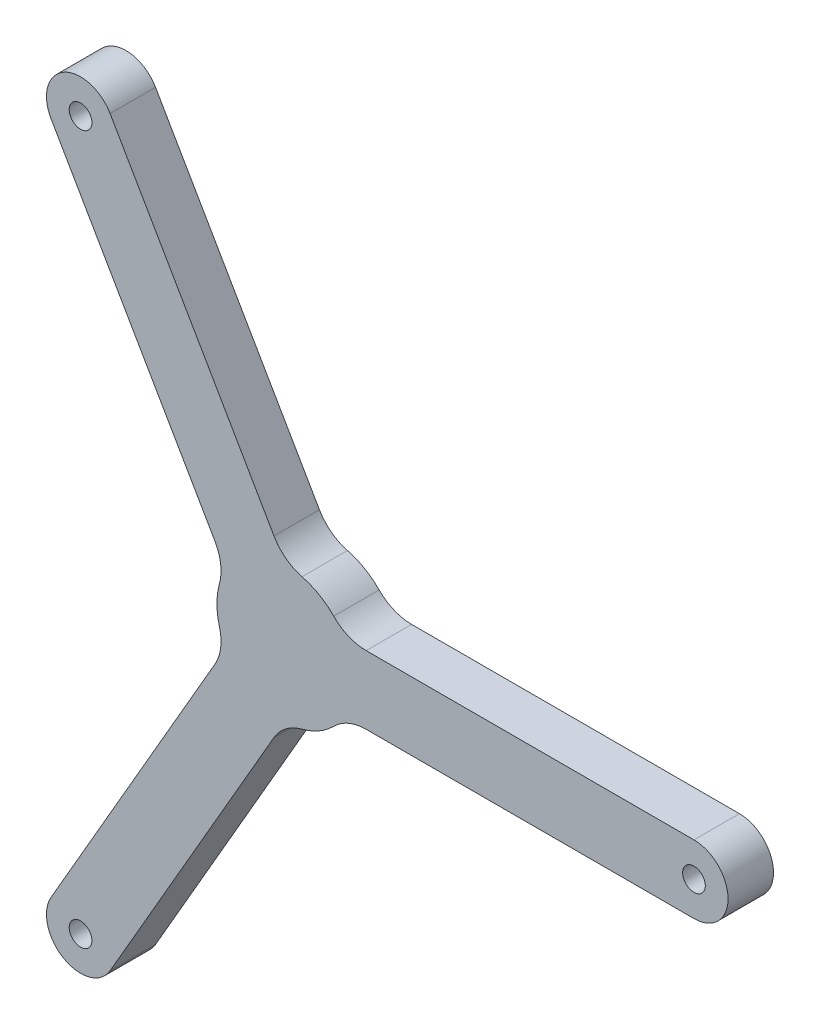
ISO-10303-21;
HEADER;
FILE_DESCRIPTION(('STEP AP214'),'2;1');
FILE_NAME('part.step','',(''),(''),'','','');
FILE_SCHEMA(('AUTOMOTIVE_DESIGN { 1 0 10303 214 1 1 1 1 }'));
ENDSEC;
DATA;
#1=APPLICATION_CONTEXT('core data for automotive mechanical design processes');
#2=APPLICATION_PROTOCOL_DEFINITION('international standard','automotive_design',2000,#1);
#3=PRODUCT_CONTEXT('',#1,'mechanical');
#4=PRODUCT('Part','Part','',(#3));
#5=PRODUCT_RELATED_PRODUCT_CATEGORY('part','',(#4));
#6=PRODUCT_DEFINITION_FORMATION('','',#4);
#7=PRODUCT_DEFINITION_CONTEXT('part definition',#1,'design');
#8=PRODUCT_DEFINITION('design','',#6,#7);
#9=PRODUCT_DEFINITION_SHAPE('','',#8);
#10=(LENGTH_UNIT() NAMED_UNIT(*) SI_UNIT(.MILLI.,.METRE.));
#11=(NAMED_UNIT(*) PLANE_ANGLE_UNIT() SI_UNIT($,.RADIAN.));
#12=(NAMED_UNIT(*) SI_UNIT($,.STERADIAN.) SOLID_ANGLE_UNIT());
#13=UNCERTAINTY_MEASURE_WITH_UNIT(LENGTH_MEASURE(1.E-05),#10,'distance_accuracy_value','');
#14=(GEOMETRIC_REPRESENTATION_CONTEXT(3) GLOBAL_UNCERTAINTY_ASSIGNED_CONTEXT((#13)) GLOBAL_UNIT_ASSIGNED_CONTEXT((#10,
#11,#12)) REPRESENTATION_CONTEXT('',''));
#15=CARTESIAN_POINT('',(0.,0.,0.));
#16=DIRECTION('',(0.,0.,1.));
#17=DIRECTION('',(1.,0.,0.));
#18=AXIS2_PLACEMENT_3D('',#15,#16,#17);
#19=CARTESIAN_POINT('',(0.,0.,10.));
#20=DIRECTION('',(0.,0.,-1.));
#21=DIRECTION('',(-1.,0.,0.));
#22=AXIS2_PLACEMENT_3D('',#19,#20,#21);
#23=CYLINDRICAL_SURFACE('',#22,15.);
#24=DIRECTION('',(0.,0.,-1.));
#25=VECTOR('',#24,1.);
#26=CARTESIAN_POINT('',(-14.4493380611438,-4.02698765763967,10.));
#27=LINE('',#26,#25);
#28=CARTESIAN_POINT('',(-14.4493380611438,-4.02698765763967,0.));
#29=VERTEX_POINT('',#28);
#30=CARTESIAN_POINT('',(-14.4493380611438,-4.02698765763967,10.));
#31=VERTEX_POINT('',#30);
#32=EDGE_CURVE('E60',#29,#31,#27,.F.);
#33=ORIENTED_EDGE('',*,*,#32,.T.);
#34=CARTESIAN_POINT('',(0.,0.,10.));
#35=DIRECTION('',(0.,0.,1.));
#36=DIRECTION('',(1.,0.,0.));
#37=AXIS2_PLACEMENT_3D('',#34,#35,#36);
#38=CIRCLE('',#37,15.);
#39=CARTESIAN_POINT('',(-14.4493380611437,4.02698765763987,10.));
#40=VERTEX_POINT('',#39);
#41=EDGE_CURVE('E278',#40,#31,#38,.T.);
#42=ORIENTED_EDGE('',*,*,#41,.F.);
#43=DIRECTION('',(0.,0.,-1.));
#44=VECTOR('',#43,1.);
#45=CARTESIAN_POINT('',(-14.4493380611437,4.02698765763987,10.));
#46=LINE('',#45,#44);
#47=CARTESIAN_POINT('',(-14.4493380611437,4.02698765763987,0.));
#48=VERTEX_POINT('',#47);
#49=EDGE_CURVE('E206',#40,#48,#46,.T.);
#50=ORIENTED_EDGE('',*,*,#49,.T.);
#51=CARTESIAN_POINT('',(0.,0.,0.));
#52=DIRECTION('',(0.,0.,1.));
#53=DIRECTION('',(1.,0.,0.));
#54=AXIS2_PLACEMENT_3D('',#51,#52,#53);
#55=CIRCLE('',#54,15.);
#56=EDGE_CURVE('E292',#48,#29,#55,.T.);
#57=ORIENTED_EDGE('',*,*,#56,.T.);
#58=EDGE_LOOP('',(#33,#42,#50,#57));
#59=FACE_BOUND('',#58,.T.);
#60=ADVANCED_FACE('F37',(#59),#23,.T.);
#61=DIRECTION('',(0.,0.,-1.));
#62=VECTOR('',#61,1.);
#63=CARTESIAN_POINT('',(3.7371954183296,14.5269876576397,10.));
#64=LINE('',#63,#62);
#65=CARTESIAN_POINT('',(3.7371954183296,14.5269876576397,0.));
#66=VERTEX_POINT('',#65);
#67=CARTESIAN_POINT('',(3.7371954183296,14.5269876576397,10.));
#68=VERTEX_POINT('',#67);
#69=EDGE_CURVE('E173',#66,#68,#64,.F.);
#70=ORIENTED_EDGE('',*,*,#69,.T.);
#71=CARTESIAN_POINT('',(10.7121426428143,10.5,10.));
#72=VERTEX_POINT('',#71);
#73=EDGE_CURVE('E275',#72,#68,#38,.T.);
#74=ORIENTED_EDGE('',*,*,#73,.F.);
#75=DIRECTION('',(0.,0.,-1.));
#76=VECTOR('',#75,1.);
#77=CARTESIAN_POINT('',(10.7121426428143,10.5,10.));
#78=LINE('',#77,#76);
#79=CARTESIAN_POINT('',(10.7121426428143,10.5,0.));
#80=VERTEX_POINT('',#79);
#81=EDGE_CURVE('E301',#72,#80,#78,.T.);
#82=ORIENTED_EDGE('',*,*,#81,.T.);
#83=EDGE_CURVE('E290',#80,#66,#55,.T.);
#84=ORIENTED_EDGE('',*,*,#83,.T.);
#85=EDGE_LOOP('',(#70,#74,#82,#84));
#86=FACE_BOUND('',#85,.T.);
#87=ADVANCED_FACE('F362',(#86),#23,.T.);
#88=CARTESIAN_POINT('',(0.,-7.5,10.));
#89=DIRECTION('',(0.,-1.,0.));
#90=DIRECTION('',(1.,0.,0.));
#91=AXIS2_PLACEMENT_3D('',#88,#89,#90);
#92=PLANE('',#91);
#93=DIRECTION('',(-1.,0.,0.));
#94=VECTOR('',#93,1.);
#95=CARTESIAN_POINT('',(0.,-7.5,10.));
#96=LINE('',#95,#94);
#97=CARTESIAN_POINT('',(90.,-7.5,10.));
#98=VERTEX_POINT('',#97);
#99=CARTESIAN_POINT('',(17.8535710713571,-7.5,10.));
#100=VERTEX_POINT('',#99);
#101=EDGE_CURVE('E266',#98,#100,#96,.T.);
#102=ORIENTED_EDGE('',*,*,#101,.T.);
#103=DIRECTION('',(0.,0.,-1.));
#104=VECTOR('',#103,1.);
#105=CARTESIAN_POINT('',(17.8535710713571,-7.5,10.));
#106=LINE('',#105,#104);
#107=CARTESIAN_POINT('',(17.8535710713571,-7.5,0.));
#108=VERTEX_POINT('',#107);
#109=EDGE_CURVE('E306',#100,#108,#106,.T.);
#110=ORIENTED_EDGE('',*,*,#109,.T.);
#111=DIRECTION('',(-1.,0.,0.));
#112=VECTOR('',#111,1.);
#113=CARTESIAN_POINT('',(0.,-7.5,0.));
#114=LINE('',#113,#112);
#115=CARTESIAN_POINT('',(90.,-7.5,0.));
#116=VERTEX_POINT('',#115);
#117=EDGE_CURVE('E265',#116,#108,#114,.T.);
#118=ORIENTED_EDGE('',*,*,#117,.F.);
#119=DIRECTION('',(0.,0.,-1.));
#120=VECTOR('',#119,1.);
#121=CARTESIAN_POINT('',(90.,-7.5,10.));
#122=LINE('',#121,#120);
#123=EDGE_CURVE('E297',#98,#116,#122,.T.);
#124=ORIENTED_EDGE('',*,*,#123,.F.);
#125=EDGE_LOOP('',(#102,#110,#118,#124));
#126=FACE_BOUND('',#125,.T.);
#127=ADVANCED_FACE('F367',(#126),#92,.T.);
#128=CARTESIAN_POINT('',(90.,0.,10.));
#129=DIRECTION('',(0.,0.,-1.));
#130=DIRECTION('',(-1.,0.,0.));
#131=AXIS2_PLACEMENT_3D('',#128,#129,#130);
#132=CYLINDRICAL_SURFACE('',#131,7.5);
#133=CARTESIAN_POINT('',(90.,0.,0.));
#134=DIRECTION('',(0.,0.,1.));
#135=DIRECTION('',(1.,0.,0.));
#136=AXIS2_PLACEMENT_3D('',#133,#134,#135);
#137=CIRCLE('',#136,7.5);
#138=CARTESIAN_POINT('',(90.,7.5,0.));
#139=VERTEX_POINT('',#138);
#140=EDGE_CURVE('E284',#116,#139,#137,.T.);
#141=ORIENTED_EDGE('',*,*,#140,.T.);
#142=DIRECTION('',(0.,0.,-1.));
#143=VECTOR('',#142,1.);
#144=CARTESIAN_POINT('',(90.,7.5,10.));
#145=LINE('',#144,#143);
#146=CARTESIAN_POINT('',(90.,7.5,10.));
#147=VERTEX_POINT('',#146);
#148=EDGE_CURVE('E281',#147,#139,#145,.T.);
#149=ORIENTED_EDGE('',*,*,#148,.F.);
#150=CARTESIAN_POINT('',(90.,0.,10.));
#151=DIRECTION('',(0.,0.,1.));
#152=DIRECTION('',(1.,0.,0.));
#153=AXIS2_PLACEMENT_3D('',#150,#151,#152);
#154=CIRCLE('',#153,7.5);
#155=EDGE_CURVE('E269',#98,#147,#154,.T.);
#156=ORIENTED_EDGE('',*,*,#155,.F.);
#157=ORIENTED_EDGE('',*,*,#123,.T.);
#158=EDGE_LOOP('',(#141,#149,#156,#157));
#159=FACE_BOUND('',#158,.T.);
#160=ADVANCED_FACE('F379',(#159),#132,.T.);
#161=CARTESIAN_POINT('',(0.,7.5,10.));
#162=DIRECTION('',(0.,1.,0.));
#163=DIRECTION('',(-1.,0.,0.));
#164=AXIS2_PLACEMENT_3D('',#161,#162,#163);
#165=PLANE('',#164);
#166=DIRECTION('',(1.,0.,0.));
#167=VECTOR('',#166,1.);
#168=CARTESIAN_POINT('',(0.,7.5,0.));
#169=LINE('',#168,#167);
#170=CARTESIAN_POINT('',(17.8535710713571,7.5,0.));
#171=VERTEX_POINT('',#170);
#172=EDGE_CURVE('E287',#171,#139,#169,.T.);
#173=ORIENTED_EDGE('',*,*,#172,.F.);
#174=DIRECTION('',(0.,0.,-1.));
#175=VECTOR('',#174,1.);
#176=CARTESIAN_POINT('',(17.8535710713571,7.5,10.));
#177=LINE('',#176,#175);
#178=CARTESIAN_POINT('',(17.8535710713571,7.5,10.));
#179=VERTEX_POINT('',#178);
#180=EDGE_CURVE('E304',#171,#179,#177,.F.);
#181=ORIENTED_EDGE('',*,*,#180,.T.);
#182=DIRECTION('',(1.,0.,0.));
#183=VECTOR('',#182,1.);
#184=CARTESIAN_POINT('',(0.,7.5,10.));
#185=LINE('',#184,#183);
#186=EDGE_CURVE('E273',#179,#147,#185,.T.);
#187=ORIENTED_EDGE('',*,*,#186,.T.);
#188=ORIENTED_EDGE('',*,*,#148,.T.);
#189=EDGE_LOOP('',(#173,#181,#187,#188));
#190=FACE_BOUND('',#189,.T.);
#191=ADVANCED_FACE('F373',(#190),#165,.T.);
#192=CARTESIAN_POINT('',(3.7371954183294,-14.5269876576398,10.));
#193=VERTEX_POINT('',#192);
#194=CARTESIAN_POINT('',(10.7121426428143,-10.5,10.));
#195=VERTEX_POINT('',#194);
#196=EDGE_CURVE('E52',#193,#195,#38,.T.);
#197=ORIENTED_EDGE('',*,*,#196,.F.);
#198=DIRECTION('',(0.,0.,-1.));
#199=VECTOR('',#198,1.);
#200=CARTESIAN_POINT('',(3.7371954183294,-14.5269876576398,10.));
#201=LINE('',#200,#199);
#202=CARTESIAN_POINT('',(3.7371954183294,-14.5269876576398,0.));
#203=VERTEX_POINT('',#202);
#204=EDGE_CURVE('E249',#193,#203,#201,.T.);
#205=ORIENTED_EDGE('',*,*,#204,.T.);
#206=CARTESIAN_POINT('',(10.7121426428143,-10.5,0.));
#207=VERTEX_POINT('',#206);
#208=EDGE_CURVE('E289',#203,#207,#55,.T.);
#209=ORIENTED_EDGE('',*,*,#208,.T.);
#210=DIRECTION('',(0.,0.,-1.));
#211=VECTOR('',#210,1.);
#212=CARTESIAN_POINT('',(10.7121426428143,-10.5,10.));
#213=LINE('',#212,#211);
#214=EDGE_CURVE('E299',#207,#195,#213,.F.);
#215=ORIENTED_EDGE('',*,*,#214,.T.);
#216=EDGE_LOOP('',(#197,#205,#209,#215));
#217=FACE_BOUND('',#216,.T.);
#218=ADVANCED_FACE('F325',(#217),#23,.T.);
#219=CARTESIAN_POINT('',(90.,0.,10.));
#220=DIRECTION('',(0.,0.,-1.));
#221=DIRECTION('',(-1.,0.,0.));
#222=AXIS2_PLACEMENT_3D('',#219,#220,#221);
#223=CYLINDRICAL_SURFACE('',#222,2.5);
#224=CARTESIAN_POINT('',(90.,0.,10.));
#225=DIRECTION('',(0.,0.,1.));
#226=DIRECTION('',(1.,0.,0.));
#227=AXIS2_PLACEMENT_3D('',#224,#225,#226);
#228=CIRCLE('',#227,2.5);
#229=CARTESIAN_POINT('',(92.5,0.,10.));
#230=VERTEX_POINT('',#229);
#231=EDGE_CURVE('E277',#230,#230,#228,.T.);
#232=ORIENTED_EDGE('',*,*,#231,.T.);
#233=EDGE_LOOP('',(#232));
#234=FACE_BOUND('',#233,.T.);
#235=CARTESIAN_POINT('',(90.,0.,0.));
#236=DIRECTION('',(0.,0.,1.));
#237=DIRECTION('',(1.,0.,0.));
#238=AXIS2_PLACEMENT_3D('',#235,#236,#237);
#239=CIRCLE('',#238,2.5);
#240=CARTESIAN_POINT('',(92.5,0.,0.));
#241=VERTEX_POINT('',#240);
#242=EDGE_CURVE('E270',#241,#241,#239,.T.);
#243=ORIENTED_EDGE('',*,*,#242,.F.);
#244=EDGE_LOOP('',(#243));
#245=FACE_BOUND('',#244,.T.);
#246=ADVANCED_FACE('F372',(#234,#245),#223,.F.);
#247=CARTESIAN_POINT('',(0.,0.,10.));
#248=DIRECTION('',(0.,0.,1.));
#249=DIRECTION('',(1.,0.,0.));
#250=AXIS2_PLACEMENT_3D('',#247,#248,#249);
#251=PLANE('',#250);
#252=ORIENTED_EDGE('',*,*,#196,.T.);
#253=CARTESIAN_POINT('',(17.8535710713571,-17.5,10.));
#254=DIRECTION('',(0.,0.,1.));
#255=DIRECTION('',(1.,0.,0.));
#256=AXIS2_PLACEMENT_3D('',#253,#254,#255);
#257=CIRCLE('',#256,10.);
#258=EDGE_CURVE('E11',#195,#100,#257,.F.);
#259=ORIENTED_EDGE('',*,*,#258,.T.);
#260=ORIENTED_EDGE('',*,*,#101,.F.);
#261=ORIENTED_EDGE('',*,*,#155,.T.);
#262=ORIENTED_EDGE('',*,*,#186,.F.);
#263=CARTESIAN_POINT('',(17.8535710713571,17.5,10.));
#264=DIRECTION('',(0.,0.,1.));
#265=DIRECTION('',(1.,0.,0.));
#266=AXIS2_PLACEMENT_3D('',#263,#264,#265);
#267=CIRCLE('',#266,10.);
#268=EDGE_CURVE('E311',#179,#72,#267,.F.);
#269=ORIENTED_EDGE('',*,*,#268,.T.);
#270=ORIENTED_EDGE('',*,*,#73,.T.);
#271=CARTESIAN_POINT('',(6.22865903054934,24.2116460960662,10.));
#272=DIRECTION('',(0.,0.,1.));
#273=DIRECTION('',(-0.499999999999992,0.866025403784443,0.));
#274=AXIS2_PLACEMENT_3D('',#271,#272,#273);
#275=CIRCLE('',#274,10.);
#276=CARTESIAN_POINT('',(-2.43159500729509,19.2116460960663,10.));
#277=VERTEX_POINT('',#276);
#278=EDGE_CURVE('E189',#68,#277,#275,.F.);
#279=ORIENTED_EDGE('',*,*,#278,.T.);
#280=DIRECTION('',(0.499999999999992,-0.866025403784443,0.));
#281=VECTOR('',#280,1.);
#282=CARTESIAN_POINT('',(6.49519052838332,3.74999999999994,10.));
#283=LINE('',#282,#281);
#284=CARTESIAN_POINT('',(-38.504809471616,81.6922863405998,10.));
#285=VERTEX_POINT('',#284);
#286=EDGE_CURVE('E166',#285,#277,#283,.T.);
#287=ORIENTED_EDGE('',*,*,#286,.F.);
#288=CARTESIAN_POINT('',(-44.9999999999993,77.9422863405999,10.));
#289=DIRECTION('',(0.,0.,1.));
#290=DIRECTION('',(-0.499999999999992,0.866025403784443,0.));
#291=AXIS2_PLACEMENT_3D('',#288,#289,#290);
#292=CIRCLE('',#291,7.5);
#293=CARTESIAN_POINT('',(-51.4951905283826,74.1922863406,10.));
#294=VERTEX_POINT('',#293);
#295=EDGE_CURVE('E178',#285,#294,#292,.T.);
#296=ORIENTED_EDGE('',*,*,#295,.T.);
#297=DIRECTION('',(-0.499999999999992,0.866025403784443,0.));
#298=VECTOR('',#297,1.);
#299=CARTESIAN_POINT('',(-6.49519052838332,-3.74999999999994,10.));
#300=LINE('',#299,#298);
#301=CARTESIAN_POINT('',(-15.4219760640617,11.7116460960664,10.));
#302=VERTEX_POINT('',#301);
#303=EDGE_CURVE('E183',#302,#294,#300,.T.);
#304=ORIENTED_EDGE('',*,*,#303,.F.);
#305=CARTESIAN_POINT('',(-24.0822301019062,6.71164609606645,10.));
#306=DIRECTION('',(0.,0.,1.));
#307=DIRECTION('',(-0.499999999999992,0.866025403784443,0.));
#308=AXIS2_PLACEMENT_3D('',#305,#306,#307);
#309=CIRCLE('',#308,10.);
#310=EDGE_CURVE('E214',#302,#40,#309,.F.);
#311=ORIENTED_EDGE('',*,*,#310,.T.);
#312=ORIENTED_EDGE('',*,*,#41,.T.);
#313=CARTESIAN_POINT('',(-24.0822301019063,-6.71164609606612,10.));
#314=DIRECTION('',(0.,0.,1.));
#315=DIRECTION('',(-0.500000000000004,-0.866025403784436,0.));
#316=AXIS2_PLACEMENT_3D('',#313,#314,#315);
#317=CIRCLE('',#316,10.);
#318=CARTESIAN_POINT('',(-15.4219760640619,-11.7116460960662,10.));
#319=VERTEX_POINT('',#318);
#320=EDGE_CURVE('E263',#31,#319,#317,.F.);
#321=ORIENTED_EDGE('',*,*,#320,.T.);
#322=DIRECTION('',(0.500000000000004,0.866025403784436,0.));
#323=VECTOR('',#322,1.);
#324=CARTESIAN_POINT('',(-6.49519052838327,3.75000000000003,10.));
#325=LINE('',#324,#323);
#326=CARTESIAN_POINT('',(-51.4951905283836,-74.1922863405993,10.));
#327=VERTEX_POINT('',#326);
#328=EDGE_CURVE('E222',#327,#319,#325,.T.);
#329=ORIENTED_EDGE('',*,*,#328,.F.);
#330=CARTESIAN_POINT('',(-45.0000000000004,-77.9422863405993,10.));
#331=DIRECTION('',(0.,0.,1.));
#332=DIRECTION('',(-0.500000000000004,-0.866025403784436,0.));
#333=AXIS2_PLACEMENT_3D('',#330,#331,#332);
#334=CIRCLE('',#333,7.5);
#335=CARTESIAN_POINT('',(-38.5048094716171,-81.6922863405993,10.));
#336=VERTEX_POINT('',#335);
#337=EDGE_CURVE('E225',#327,#336,#334,.T.);
#338=ORIENTED_EDGE('',*,*,#337,.T.);
#339=DIRECTION('',(-0.500000000000004,-0.866025403784436,0.));
#340=VECTOR('',#339,1.);
#341=CARTESIAN_POINT('',(6.49519052838327,-3.75000000000003,10.));
#342=LINE('',#341,#340);
#343=CARTESIAN_POINT('',(-2.43159500729536,-19.2116460960662,10.));
#344=VERTEX_POINT('',#343);
#345=EDGE_CURVE('E229',#344,#336,#342,.T.);
#346=ORIENTED_EDGE('',*,*,#345,.F.);
#347=CARTESIAN_POINT('',(6.228659030549,-24.2116460960663,10.));
#348=DIRECTION('',(0.,0.,1.));
#349=DIRECTION('',(-0.500000000000004,-0.866025403784436,0.));
#350=AXIS2_PLACEMENT_3D('',#347,#348,#349);
#351=CIRCLE('',#350,10.);
#352=EDGE_CURVE('E258',#344,#193,#351,.F.);
#353=ORIENTED_EDGE('',*,*,#352,.T.);
#354=EDGE_LOOP('',(#252,#259,#260,#261,#262,#269,#270,#279,#287,#296,#304,#311,#312,#321,#329,
#338,#346,#353));
#355=FACE_BOUND('',#354,.T.);
#356=ORIENTED_EDGE('',*,*,#231,.F.);
#357=EDGE_LOOP('',(#356));
#358=FACE_BOUND('',#357,.T.);
#359=CARTESIAN_POINT('',(-45.0000000000004,-77.9422863405993,10.));
#360=DIRECTION('',(0.,0.,1.));
#361=DIRECTION('',(-0.500000000000004,-0.866025403784436,0.));
#362=AXIS2_PLACEMENT_3D('',#359,#360,#361);
#363=CIRCLE('',#362,2.5);
#364=CARTESIAN_POINT('',(-46.2500000000004,-80.1073498500604,10.));
#365=VERTEX_POINT('',#364);
#366=EDGE_CURVE('E231',#365,#365,#363,.T.);
#367=ORIENTED_EDGE('',*,*,#366,.F.);
#368=EDGE_LOOP('',(#367));
#369=FACE_BOUND('',#368,.T.);
#370=CARTESIAN_POINT('',(-44.9999999999993,77.9422863405999,10.));
#371=DIRECTION('',(0.,0.,1.));
#372=DIRECTION('',(-0.499999999999992,0.866025403784443,0.));
#373=AXIS2_PLACEMENT_3D('',#370,#371,#372);
#374=CIRCLE('',#373,2.5);
#375=CARTESIAN_POINT('',(-46.2499999999993,80.107349850061,10.));
#376=VERTEX_POINT('',#375);
#377=EDGE_CURVE('E197',#376,#376,#374,.T.);
#378=ORIENTED_EDGE('',*,*,#377,.F.);
#379=EDGE_LOOP('',(#378));
#380=FACE_BOUND('',#379,.T.);
#381=ADVANCED_FACE('F185',(#355,#358,#369,#380),#251,.T.);
#382=CARTESIAN_POINT('',(0.,0.,0.));
#383=DIRECTION('',(0.,0.,1.));
#384=DIRECTION('',(1.,0.,0.));
#385=AXIS2_PLACEMENT_3D('',#382,#383,#384);
#386=PLANE('',#385);
#387=ORIENTED_EDGE('',*,*,#83,.F.);
#388=CARTESIAN_POINT('',(17.8535710713571,17.5,0.));
#389=DIRECTION('',(0.,0.,1.));
#390=DIRECTION('',(1.,0.,0.));
#391=AXIS2_PLACEMENT_3D('',#388,#389,#390);
#392=CIRCLE('',#391,10.);
#393=EDGE_CURVE('E309',#80,#171,#392,.T.);
#394=ORIENTED_EDGE('',*,*,#393,.T.);
#395=ORIENTED_EDGE('',*,*,#172,.T.);
#396=ORIENTED_EDGE('',*,*,#140,.F.);
#397=ORIENTED_EDGE('',*,*,#117,.T.);
#398=CARTESIAN_POINT('',(17.8535710713571,-17.5,0.));
#399=DIRECTION('',(0.,0.,1.));
#400=DIRECTION('',(1.,0.,0.));
#401=AXIS2_PLACEMENT_3D('',#398,#399,#400);
#402=CIRCLE('',#401,10.);
#403=EDGE_CURVE('E45',#108,#207,#402,.T.);
#404=ORIENTED_EDGE('',*,*,#403,.T.);
#405=ORIENTED_EDGE('',*,*,#208,.F.);
#406=CARTESIAN_POINT('',(6.228659030549,-24.2116460960663,0.));
#407=DIRECTION('',(0.,0.,1.));
#408=DIRECTION('',(-0.500000000000004,-0.866025403784436,0.));
#409=AXIS2_PLACEMENT_3D('',#406,#407,#408);
#410=CIRCLE('',#409,10.);
#411=CARTESIAN_POINT('',(-2.43159500729536,-19.2116460960662,0.));
#412=VERTEX_POINT('',#411);
#413=EDGE_CURVE('E256',#203,#412,#410,.T.);
#414=ORIENTED_EDGE('',*,*,#413,.T.);
#415=DIRECTION('',(-0.500000000000004,-0.866025403784436,0.));
#416=VECTOR('',#415,1.);
#417=CARTESIAN_POINT('',(6.49519052838327,-3.75000000000003,0.));
#418=LINE('',#417,#416);
#419=CARTESIAN_POINT('',(-38.5048094716171,-81.6922863405993,0.));
#420=VERTEX_POINT('',#419);
#421=EDGE_CURVE('E240',#412,#420,#418,.T.);
#422=ORIENTED_EDGE('',*,*,#421,.T.);
#423=CARTESIAN_POINT('',(-45.0000000000004,-77.9422863405993,0.));
#424=DIRECTION('',(0.,0.,1.));
#425=DIRECTION('',(-0.500000000000004,-0.866025403784436,0.));
#426=AXIS2_PLACEMENT_3D('',#423,#424,#425);
#427=CIRCLE('',#426,7.5);
#428=CARTESIAN_POINT('',(-51.4951905283836,-74.1922863405993,0.));
#429=VERTEX_POINT('',#428);
#430=EDGE_CURVE('E237',#429,#420,#427,.T.);
#431=ORIENTED_EDGE('',*,*,#430,.F.);
#432=DIRECTION('',(0.500000000000004,0.866025403784436,0.));
#433=VECTOR('',#432,1.);
#434=CARTESIAN_POINT('',(-6.49519052838327,3.75000000000003,0.));
#435=LINE('',#434,#433);
#436=CARTESIAN_POINT('',(-15.4219760640619,-11.7116460960662,0.));
#437=VERTEX_POINT('',#436);
#438=EDGE_CURVE('E221',#429,#437,#435,.T.);
#439=ORIENTED_EDGE('',*,*,#438,.T.);
#440=CARTESIAN_POINT('',(-24.0822301019063,-6.71164609606612,0.));
#441=DIRECTION('',(0.,0.,1.));
#442=DIRECTION('',(-0.500000000000004,-0.866025403784436,0.));
#443=AXIS2_PLACEMENT_3D('',#440,#441,#442);
#444=CIRCLE('',#443,10.);
#445=EDGE_CURVE('E260',#437,#29,#444,.T.);
#446=ORIENTED_EDGE('',*,*,#445,.T.);
#447=ORIENTED_EDGE('',*,*,#56,.F.);
#448=CARTESIAN_POINT('',(-24.0822301019062,6.71164609606645,0.));
#449=DIRECTION('',(0.,0.,1.));
#450=DIRECTION('',(-0.499999999999992,0.866025403784443,0.));
#451=AXIS2_PLACEMENT_3D('',#448,#449,#450);
#452=CIRCLE('',#451,10.);
#453=CARTESIAN_POINT('',(-15.4219760640617,11.7116460960664,0.));
#454=VERTEX_POINT('',#453);
#455=EDGE_CURVE('E212',#48,#454,#452,.T.);
#456=ORIENTED_EDGE('',*,*,#455,.T.);
#457=DIRECTION('',(-0.499999999999992,0.866025403784443,0.));
#458=VECTOR('',#457,1.);
#459=CARTESIAN_POINT('',(-6.49519052838332,-3.74999999999994,0.));
#460=LINE('',#459,#458);
#461=CARTESIAN_POINT('',(-51.4951905283826,74.1922863406,0.));
#462=VERTEX_POINT('',#461);
#463=EDGE_CURVE('E193',#454,#462,#460,.T.);
#464=ORIENTED_EDGE('',*,*,#463,.T.);
#465=CARTESIAN_POINT('',(-44.9999999999993,77.9422863405999,0.));
#466=DIRECTION('',(0.,0.,1.));
#467=DIRECTION('',(-0.499999999999992,0.866025403784443,0.));
#468=AXIS2_PLACEMENT_3D('',#465,#466,#467);
#469=CIRCLE('',#468,7.5);
#470=CARTESIAN_POINT('',(-38.504809471616,81.6922863405998,0.));
#471=VERTEX_POINT('',#470);
#472=EDGE_CURVE('E201',#471,#462,#469,.T.);
#473=ORIENTED_EDGE('',*,*,#472,.F.);
#474=DIRECTION('',(0.499999999999992,-0.866025403784443,0.));
#475=VECTOR('',#474,1.);
#476=CARTESIAN_POINT('',(6.49519052838332,3.74999999999994,0.));
#477=LINE('',#476,#475);
#478=CARTESIAN_POINT('',(-2.43159500729509,19.2116460960663,0.));
#479=VERTEX_POINT('',#478);
#480=EDGE_CURVE('E169',#471,#479,#477,.T.);
#481=ORIENTED_EDGE('',*,*,#480,.T.);
#482=CARTESIAN_POINT('',(6.22865903054934,24.2116460960662,0.));
#483=DIRECTION('',(0.,0.,1.));
#484=DIRECTION('',(-0.499999999999992,0.866025403784443,0.));
#485=AXIS2_PLACEMENT_3D('',#482,#483,#484);
#486=CIRCLE('',#485,10.);
#487=EDGE_CURVE('E217',#479,#66,#486,.T.);
#488=ORIENTED_EDGE('',*,*,#487,.T.);
#489=EDGE_LOOP('',(#387,#394,#395,#396,#397,#404,#405,#414,#422,#431,#439,#446,#447,#456,#464,
#473,#481,#488));
#490=FACE_BOUND('',#489,.T.);
#491=ORIENTED_EDGE('',*,*,#242,.T.);
#492=EDGE_LOOP('',(#491));
#493=FACE_BOUND('',#492,.T.);
#494=CARTESIAN_POINT('',(-45.0000000000004,-77.9422863405993,0.));
#495=DIRECTION('',(0.,0.,1.));
#496=DIRECTION('',(-0.500000000000004,-0.866025403784436,0.));
#497=AXIS2_PLACEMENT_3D('',#494,#495,#496);
#498=CIRCLE('',#497,2.5);
#499=CARTESIAN_POINT('',(-46.2500000000004,-80.1073498500604,0.));
#500=VERTEX_POINT('',#499);
#501=EDGE_CURVE('E226',#500,#500,#498,.T.);
#502=ORIENTED_EDGE('',*,*,#501,.T.);
#503=EDGE_LOOP('',(#502));
#504=FACE_BOUND('',#503,.T.);
#505=CARTESIAN_POINT('',(-44.9999999999993,77.9422863405999,0.));
#506=DIRECTION('',(0.,0.,1.));
#507=DIRECTION('',(-0.499999999999992,0.866025403784443,0.));
#508=AXIS2_PLACEMENT_3D('',#505,#506,#507);
#509=CIRCLE('',#508,2.5);
#510=CARTESIAN_POINT('',(-46.2499999999993,80.107349850061,0.));
#511=VERTEX_POINT('',#510);
#512=EDGE_CURVE('E190',#511,#511,#509,.T.);
#513=ORIENTED_EDGE('',*,*,#512,.T.);
#514=EDGE_LOOP('',(#513));
#515=FACE_BOUND('',#514,.T.);
#516=ADVANCED_FACE('F317',(#490,#493,#504,#515),#386,.F.);
#517=CARTESIAN_POINT('',(17.8535710713571,17.5,10.));
#518=DIRECTION('',(0.,0.,-1.));
#519=DIRECTION('',(-1.,0.,0.));
#520=AXIS2_PLACEMENT_3D('',#517,#518,#519);
#521=CYLINDRICAL_SURFACE('',#520,10.);
#522=ORIENTED_EDGE('',*,*,#268,.F.);
#523=ORIENTED_EDGE('',*,*,#180,.F.);
#524=ORIENTED_EDGE('',*,*,#393,.F.);
#525=ORIENTED_EDGE('',*,*,#81,.F.);
#526=EDGE_LOOP('',(#522,#523,#524,#525));
#527=FACE_BOUND('',#526,.T.);
#528=ADVANCED_FACE('F390',(#527),#521,.F.);
#529=CARTESIAN_POINT('',(17.8535710713571,-17.5,10.));
#530=DIRECTION('',(0.,0.,-1.));
#531=DIRECTION('',(-1.,0.,0.));
#532=AXIS2_PLACEMENT_3D('',#529,#530,#531);
#533=CYLINDRICAL_SURFACE('',#532,10.);
#534=ORIENTED_EDGE('',*,*,#258,.F.);
#535=ORIENTED_EDGE('',*,*,#214,.F.);
#536=ORIENTED_EDGE('',*,*,#403,.F.);
#537=ORIENTED_EDGE('',*,*,#109,.F.);
#538=EDGE_LOOP('',(#534,#535,#536,#537));
#539=FACE_BOUND('',#538,.T.);
#540=ADVANCED_FACE('F39',(#539),#533,.F.);
#541=CARTESIAN_POINT('',(6.22865903054934,24.2116460960662,10.));
#542=DIRECTION('',(0.,0.,-1.));
#543=DIRECTION('',(0.499999999999992,-0.866025403784443,0.));
#544=AXIS2_PLACEMENT_3D('',#541,#542,#543);
#545=CYLINDRICAL_SURFACE('',#544,10.);
#546=ORIENTED_EDGE('',*,*,#278,.F.);
#547=ORIENTED_EDGE('',*,*,#69,.F.);
#548=ORIENTED_EDGE('',*,*,#487,.F.);
#549=DIRECTION('',(0.,0.,-1.));
#550=VECTOR('',#549,1.);
#551=CARTESIAN_POINT('',(-2.43159500729509,19.2116460960663,10.));
#552=LINE('',#551,#550);
#553=EDGE_CURVE('E210',#277,#479,#552,.T.);
#554=ORIENTED_EDGE('',*,*,#553,.F.);
#555=EDGE_LOOP('',(#546,#547,#548,#554));
#556=FACE_BOUND('',#555,.T.);
#557=ADVANCED_FACE('F397',(#556),#545,.F.);
#558=CARTESIAN_POINT('',(-24.0822301019062,6.71164609606645,10.));
#559=DIRECTION('',(0.,0.,-1.));
#560=DIRECTION('',(0.499999999999992,-0.866025403784443,0.));
#561=AXIS2_PLACEMENT_3D('',#558,#559,#560);
#562=CYLINDRICAL_SURFACE('',#561,10.);
#563=ORIENTED_EDGE('',*,*,#310,.F.);
#564=DIRECTION('',(0.,0.,-1.));
#565=VECTOR('',#564,1.);
#566=CARTESIAN_POINT('',(-15.4219760640617,11.7116460960664,10.));
#567=LINE('',#566,#565);
#568=EDGE_CURVE('E208',#454,#302,#567,.F.);
#569=ORIENTED_EDGE('',*,*,#568,.F.);
#570=ORIENTED_EDGE('',*,*,#455,.F.);
#571=ORIENTED_EDGE('',*,*,#49,.F.);
#572=EDGE_LOOP('',(#563,#569,#570,#571));
#573=FACE_BOUND('',#572,.T.);
#574=ADVANCED_FACE('F412',(#573),#562,.F.);
#575=CARTESIAN_POINT('',(-44.9999999999993,77.9422863405999,10.));
#576=DIRECTION('',(0.,0.,-1.));
#577=DIRECTION('',(0.499999999999992,-0.866025403784443,0.));
#578=AXIS2_PLACEMENT_3D('',#575,#576,#577);
#579=CYLINDRICAL_SURFACE('',#578,2.5);
#580=ORIENTED_EDGE('',*,*,#377,.T.);
#581=EDGE_LOOP('',(#580));
#582=FACE_BOUND('',#581,.T.);
#583=ORIENTED_EDGE('',*,*,#512,.F.);
#584=EDGE_LOOP('',(#583));
#585=FACE_BOUND('',#584,.T.);
#586=ADVANCED_FACE('F414',(#582,#585),#579,.F.);
#587=CARTESIAN_POINT('',(-6.49519052838332,-3.74999999999994,10.));
#588=DIRECTION('',(-0.866025403784443,-0.499999999999992,0.));
#589=DIRECTION('',(0.499999999999992,-0.866025403784443,0.));
#590=AXIS2_PLACEMENT_3D('',#587,#588,#589);
#591=PLANE('',#590);
#592=ORIENTED_EDGE('',*,*,#463,.F.);
#593=ORIENTED_EDGE('',*,*,#568,.T.);
#594=ORIENTED_EDGE('',*,*,#303,.T.);
#595=DIRECTION('',(0.,0.,-1.));
#596=VECTOR('',#595,1.);
#597=CARTESIAN_POINT('',(-51.4951905283826,74.1922863406,10.));
#598=LINE('',#597,#596);
#599=EDGE_CURVE('E174',#294,#462,#598,.T.);
#600=ORIENTED_EDGE('',*,*,#599,.T.);
#601=EDGE_LOOP('',(#592,#593,#594,#600));
#602=FACE_BOUND('',#601,.T.);
#603=ADVANCED_FACE('F409',(#602),#591,.T.);
#604=CARTESIAN_POINT('',(-44.9999999999993,77.9422863405999,10.));
#605=DIRECTION('',(0.,0.,-1.));
#606=DIRECTION('',(0.499999999999992,-0.866025403784443,0.));
#607=AXIS2_PLACEMENT_3D('',#604,#605,#606);
#608=CYLINDRICAL_SURFACE('',#607,7.5);
#609=ORIENTED_EDGE('',*,*,#472,.T.);
#610=ORIENTED_EDGE('',*,*,#599,.F.);
#611=ORIENTED_EDGE('',*,*,#295,.F.);
#612=DIRECTION('',(0.,0.,-1.));
#613=VECTOR('',#612,1.);
#614=CARTESIAN_POINT('',(-38.504809471616,81.6922863405998,10.));
#615=LINE('',#614,#613);
#616=EDGE_CURVE('E161',#285,#471,#615,.T.);
#617=ORIENTED_EDGE('',*,*,#616,.T.);
#618=EDGE_LOOP('',(#609,#610,#611,#617));
#619=FACE_BOUND('',#618,.T.);
#620=ADVANCED_FACE('F179',(#619),#608,.T.);
#621=CARTESIAN_POINT('',(6.49519052838332,3.74999999999994,10.));
#622=DIRECTION('',(0.866025403784443,0.499999999999992,0.));
#623=DIRECTION('',(-0.499999999999992,0.866025403784443,0.));
#624=AXIS2_PLACEMENT_3D('',#621,#622,#623);
#625=PLANE('',#624);
#626=ORIENTED_EDGE('',*,*,#286,.T.);
#627=ORIENTED_EDGE('',*,*,#553,.T.);
#628=ORIENTED_EDGE('',*,*,#480,.F.);
#629=ORIENTED_EDGE('',*,*,#616,.F.);
#630=EDGE_LOOP('',(#626,#627,#628,#629));
#631=FACE_BOUND('',#630,.T.);
#632=ADVANCED_FACE('F163',(#631),#625,.T.);
#633=CARTESIAN_POINT('',(-6.49519052838327,3.75000000000003,10.));
#634=DIRECTION('',(-0.866025403784436,0.500000000000004,0.));
#635=DIRECTION('',(-0.500000000000004,-0.866025403784436,0.));
#636=AXIS2_PLACEMENT_3D('',#633,#634,#635);
#637=PLANE('',#636);
#638=ORIENTED_EDGE('',*,*,#328,.T.);
#639=DIRECTION('',(0.,0.,-1.));
#640=VECTOR('',#639,1.);
#641=CARTESIAN_POINT('',(-15.4219760640619,-11.7116460960662,10.));
#642=LINE('',#641,#640);
#643=EDGE_CURVE('E253',#319,#437,#642,.T.);
#644=ORIENTED_EDGE('',*,*,#643,.T.);
#645=ORIENTED_EDGE('',*,*,#438,.F.);
#646=DIRECTION('',(0.,0.,-1.));
#647=VECTOR('',#646,1.);
#648=CARTESIAN_POINT('',(-51.4951905283836,-74.1922863405993,10.));
#649=LINE('',#648,#647);
#650=EDGE_CURVE('E246',#327,#429,#649,.T.);
#651=ORIENTED_EDGE('',*,*,#650,.F.);
#652=EDGE_LOOP('',(#638,#644,#645,#651));
#653=FACE_BOUND('',#652,.T.);
#654=ADVANCED_FACE('F338',(#653),#637,.T.);
#655=CARTESIAN_POINT('',(-45.0000000000004,-77.9422863405993,10.));
#656=DIRECTION('',(0.,0.,-1.));
#657=DIRECTION('',(0.500000000000004,0.866025403784436,0.));
#658=AXIS2_PLACEMENT_3D('',#655,#656,#657);
#659=CYLINDRICAL_SURFACE('',#658,7.5);
#660=ORIENTED_EDGE('',*,*,#430,.T.);
#661=DIRECTION('',(0.,0.,-1.));
#662=VECTOR('',#661,1.);
#663=CARTESIAN_POINT('',(-38.5048094716171,-81.6922863405993,10.));
#664=LINE('',#663,#662);
#665=EDGE_CURVE('E234',#336,#420,#664,.T.);
#666=ORIENTED_EDGE('',*,*,#665,.F.);
#667=ORIENTED_EDGE('',*,*,#337,.F.);
#668=ORIENTED_EDGE('',*,*,#650,.T.);
#669=EDGE_LOOP('',(#660,#666,#667,#668));
#670=FACE_BOUND('',#669,.T.);
#671=ADVANCED_FACE('F342',(#670),#659,.T.);
#672=CARTESIAN_POINT('',(6.49519052838327,-3.75000000000003,10.));
#673=DIRECTION('',(0.866025403784436,-0.500000000000004,0.));
#674=DIRECTION('',(0.500000000000004,0.866025403784436,0.));
#675=AXIS2_PLACEMENT_3D('',#672,#673,#674);
#676=PLANE('',#675);
#677=ORIENTED_EDGE('',*,*,#421,.F.);
#678=DIRECTION('',(0.,0.,-1.));
#679=VECTOR('',#678,1.);
#680=CARTESIAN_POINT('',(-2.43159500729536,-19.2116460960662,10.));
#681=LINE('',#680,#679);
#682=EDGE_CURVE('E251',#412,#344,#681,.F.);
#683=ORIENTED_EDGE('',*,*,#682,.T.);
#684=ORIENTED_EDGE('',*,*,#345,.T.);
#685=ORIENTED_EDGE('',*,*,#665,.T.);
#686=EDGE_LOOP('',(#677,#683,#684,#685));
#687=FACE_BOUND('',#686,.T.);
#688=ADVANCED_FACE('F350',(#687),#676,.T.);
#689=CARTESIAN_POINT('',(-45.0000000000004,-77.9422863405993,10.));
#690=DIRECTION('',(0.,0.,-1.));
#691=DIRECTION('',(0.500000000000004,0.866025403784436,0.));
#692=AXIS2_PLACEMENT_3D('',#689,#690,#691);
#693=CYLINDRICAL_SURFACE('',#692,2.5);
#694=ORIENTED_EDGE('',*,*,#366,.T.);
#695=EDGE_LOOP('',(#694));
#696=FACE_BOUND('',#695,.T.);
#697=ORIENTED_EDGE('',*,*,#501,.F.);
#698=EDGE_LOOP('',(#697));
#699=FACE_BOUND('',#698,.T.);
#700=ADVANCED_FACE('F352',(#696,#699),#693,.F.);
#701=CARTESIAN_POINT('',(6.228659030549,-24.2116460960663,10.));
#702=DIRECTION('',(0.,0.,-1.));
#703=DIRECTION('',(0.500000000000004,0.866025403784436,0.));
#704=AXIS2_PLACEMENT_3D('',#701,#702,#703);
#705=CYLINDRICAL_SURFACE('',#704,10.);
#706=ORIENTED_EDGE('',*,*,#352,.F.);
#707=ORIENTED_EDGE('',*,*,#682,.F.);
#708=ORIENTED_EDGE('',*,*,#413,.F.);
#709=ORIENTED_EDGE('',*,*,#204,.F.);
#710=EDGE_LOOP('',(#706,#707,#708,#709));
#711=FACE_BOUND('',#710,.T.);
#712=ADVANCED_FACE('F348',(#711),#705,.F.);
#713=CARTESIAN_POINT('',(-24.0822301019063,-6.71164609606612,10.));
#714=DIRECTION('',(0.,0.,-1.));
#715=DIRECTION('',(0.500000000000004,0.866025403784436,0.));
#716=AXIS2_PLACEMENT_3D('',#713,#714,#715);
#717=CYLINDRICAL_SURFACE('',#716,10.);
#718=ORIENTED_EDGE('',*,*,#320,.F.);
#719=ORIENTED_EDGE('',*,*,#32,.F.);
#720=ORIENTED_EDGE('',*,*,#445,.F.);
#721=ORIENTED_EDGE('',*,*,#643,.F.);
#722=EDGE_LOOP('',(#718,#719,#720,#721));
#723=FACE_BOUND('',#722,.T.);
#724=ADVANCED_FACE('F335',(#723),#717,.F.);
#725=CLOSED_SHELL('',(#60,#87,#127,#160,#191,#218,#246,#381,#516,#528,#540,#557,#574,#586,#603,
#620,#632,#654,#671,#688,#700,#712,#724));
#726=MANIFOLD_SOLID_BREP('B2',#725);
#727=ADVANCED_BREP_SHAPE_REPRESENTATION('',(#18,#726),#14);
#728=SHAPE_DEFINITION_REPRESENTATION(#9,#727);
ENDSEC;
END-ISO-10303-21;
